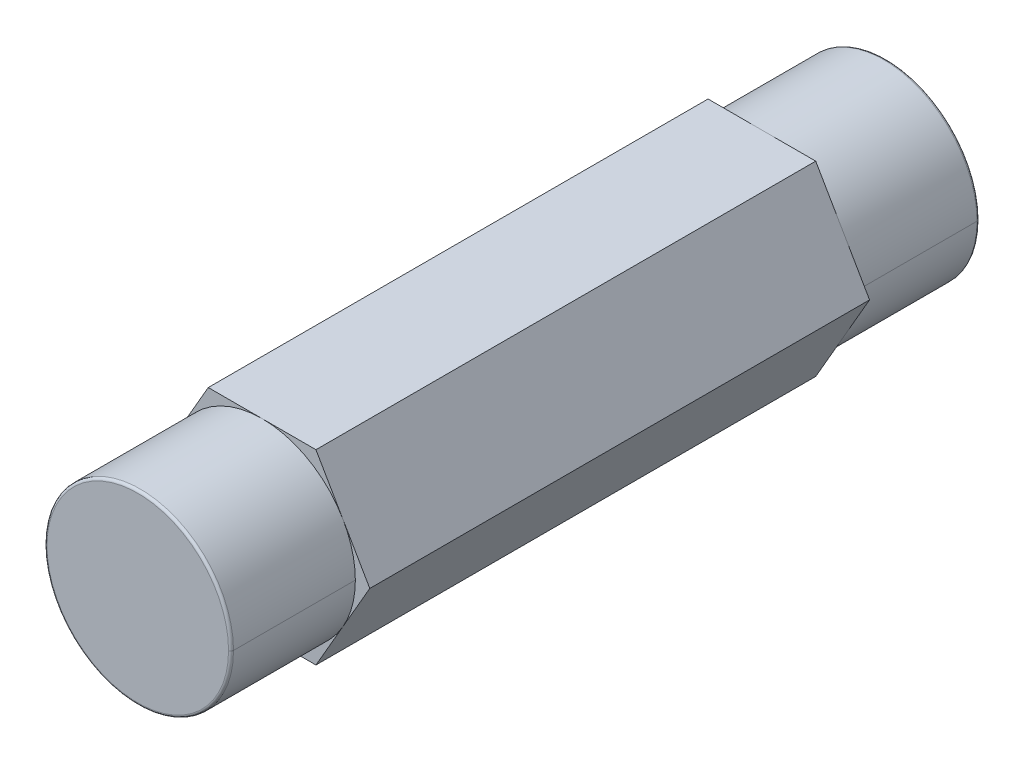
ISO-10303-21;
HEADER;
FILE_DESCRIPTION(('STEP AP214'),'2;1');
FILE_NAME('part.step','',(''),(''),'','','');
FILE_SCHEMA(('AUTOMOTIVE_DESIGN { 1 0 10303 214 1 1 1 1 }'));
ENDSEC;
DATA;
#1=APPLICATION_CONTEXT('core data for automotive mechanical design processes');
#2=APPLICATION_PROTOCOL_DEFINITION('international standard','automotive_design',2000,#1);
#3=PRODUCT_CONTEXT('',#1,'mechanical');
#4=PRODUCT('Part','Part','',(#3));
#5=PRODUCT_RELATED_PRODUCT_CATEGORY('part','',(#4));
#6=PRODUCT_DEFINITION_FORMATION('','',#4);
#7=PRODUCT_DEFINITION_CONTEXT('part definition',#1,'design');
#8=PRODUCT_DEFINITION('design','',#6,#7);
#9=PRODUCT_DEFINITION_SHAPE('','',#8);
#10=(LENGTH_UNIT() NAMED_UNIT(*) SI_UNIT(.MILLI.,.METRE.));
#11=(NAMED_UNIT(*) PLANE_ANGLE_UNIT() SI_UNIT($,.RADIAN.));
#12=(NAMED_UNIT(*) SI_UNIT($,.STERADIAN.) SOLID_ANGLE_UNIT());
#13=UNCERTAINTY_MEASURE_WITH_UNIT(LENGTH_MEASURE(1.E-05),#10,'distance_accuracy_value','');
#14=(GEOMETRIC_REPRESENTATION_CONTEXT(3) GLOBAL_UNCERTAINTY_ASSIGNED_CONTEXT((#13)) GLOBAL_UNIT_ASSIGNED_CONTEXT((#10,
#11,#12)) REPRESENTATION_CONTEXT('',''));
#15=CARTESIAN_POINT('',(0.,0.,0.));
#16=DIRECTION('',(0.,0.,1.));
#17=DIRECTION('',(1.,0.,0.));
#18=AXIS2_PLACEMENT_3D('',#15,#16,#17);
#19=CARTESIAN_POINT('',(0.,0.,38.1));
#20=DIRECTION('',(0.,0.,1.));
#21=DIRECTION('',(1.,0.,0.));
#22=AXIS2_PLACEMENT_3D('',#19,#20,#21);
#23=TOROIDAL_SURFACE('',#22,4.6355,0.127);
#24=CARTESIAN_POINT('',(0.,0.,38.1));
#25=DIRECTION('',(0.,0.,-1.));
#26=DIRECTION('',(1.,0.,0.));
#27=AXIS2_PLACEMENT_3D('',#24,#25,#26);
#28=CIRCLE('',#27,4.7625);
#29=CARTESIAN_POINT('',(-4.7625,0.,38.1));
#30=VERTEX_POINT('',#29);
#31=CARTESIAN_POINT('',(4.7625,0.,38.1));
#32=VERTEX_POINT('',#31);
#33=EDGE_CURVE('E41',#30,#32,#28,.T.);
#34=ORIENTED_EDGE('',*,*,#33,.F.);
#35=CARTESIAN_POINT('',(-4.6355,0.,38.1));
#36=DIRECTION('',(0.,1.,0.));
#37=DIRECTION('',(-1.,0.,0.));
#38=AXIS2_PLACEMENT_3D('',#35,#36,#37);
#39=CIRCLE('',#38,0.127);
#40=CARTESIAN_POINT('',(-4.6355,0.,38.227));
#41=VERTEX_POINT('',#40);
#42=EDGE_CURVE('E11',#30,#41,#39,.T.);
#43=ORIENTED_EDGE('',*,*,#42,.T.);
#44=CARTESIAN_POINT('',(0.,0.,38.227));
#45=DIRECTION('',(0.,0.,1.));
#46=DIRECTION('',(1.,0.,0.));
#47=AXIS2_PLACEMENT_3D('',#44,#45,#46);
#48=CIRCLE('',#47,4.6355);
#49=CARTESIAN_POINT('',(4.6355,0.,38.227));
#50=VERTEX_POINT('',#49);
#51=EDGE_CURVE('E320',#50,#41,#48,.T.);
#52=ORIENTED_EDGE('',*,*,#51,.F.);
#53=CARTESIAN_POINT('',(4.6355,0.,38.1));
#54=DIRECTION('',(0.,-1.,0.));
#55=DIRECTION('',(0.,0.,-1.));
#56=AXIS2_PLACEMENT_3D('',#53,#54,#55);
#57=CIRCLE('',#56,0.127000000000002);
#58=EDGE_CURVE('E305',#32,#50,#57,.T.);
#59=ORIENTED_EDGE('',*,*,#58,.F.);
#60=EDGE_LOOP('',(#34,#43,#52,#59));
#61=FACE_BOUND('',#60,.T.);
#62=ADVANCED_FACE('F16',(#61),#23,.T.);
#63=CARTESIAN_POINT('',(0.,0.,0.127));
#64=DIRECTION('',(0.,0.,1.));
#65=DIRECTION('',(1.,0.,0.));
#66=AXIS2_PLACEMENT_3D('',#63,#64,#65);
#67=TOROIDAL_SURFACE('',#66,4.6355,0.127);
#68=CARTESIAN_POINT('',(0.,0.,0.));
#69=DIRECTION('',(0.,0.,-1.));
#70=DIRECTION('',(1.,0.,0.));
#71=AXIS2_PLACEMENT_3D('',#68,#69,#70);
#72=CIRCLE('',#71,4.6355);
#73=CARTESIAN_POINT('',(-4.6355,0.,0.));
#74=VERTEX_POINT('',#73);
#75=CARTESIAN_POINT('',(4.6355,0.,0.));
#76=VERTEX_POINT('',#75);
#77=EDGE_CURVE('E313',#74,#76,#72,.T.);
#78=ORIENTED_EDGE('',*,*,#77,.F.);
#79=CARTESIAN_POINT('',(-4.6355,0.,0.127));
#80=DIRECTION('',(0.,1.,0.));
#81=DIRECTION('',(-1.,0.,0.));
#82=AXIS2_PLACEMENT_3D('',#79,#80,#81);
#83=CIRCLE('',#82,0.127);
#84=CARTESIAN_POINT('',(-4.7625,0.,0.127));
#85=VERTEX_POINT('',#84);
#86=EDGE_CURVE('E27',#74,#85,#83,.T.);
#87=ORIENTED_EDGE('',*,*,#86,.T.);
#88=CARTESIAN_POINT('',(0.,0.,0.127));
#89=DIRECTION('',(0.,0.,1.));
#90=DIRECTION('',(1.,0.,0.));
#91=AXIS2_PLACEMENT_3D('',#88,#89,#90);
#92=CIRCLE('',#91,4.7625);
#93=CARTESIAN_POINT('',(4.7625,0.,0.127));
#94=VERTEX_POINT('',#93);
#95=EDGE_CURVE('E239',#94,#85,#92,.T.);
#96=ORIENTED_EDGE('',*,*,#95,.F.);
#97=CARTESIAN_POINT('',(4.6355,0.,0.127));
#98=DIRECTION('',(0.,-1.,0.));
#99=DIRECTION('',(0.,0.,-1.));
#100=AXIS2_PLACEMENT_3D('',#97,#98,#99);
#101=CIRCLE('',#100,0.127);
#102=EDGE_CURVE('E231',#76,#94,#101,.T.);
#103=ORIENTED_EDGE('',*,*,#102,.F.);
#104=EDGE_LOOP('',(#78,#87,#96,#103));
#105=FACE_BOUND('',#104,.T.);
#106=ADVANCED_FACE('F18',(#105),#67,.T.);
#107=CARTESIAN_POINT('',(0.,0.,6.35));
#108=DIRECTION('',(0.,0.,-1.));
#109=DIRECTION('',(-1.,0.,0.));
#110=AXIS2_PLACEMENT_3D('',#107,#108,#109);
#111=CYLINDRICAL_SURFACE('',#110,4.7625);
#112=CARTESIAN_POINT('',(0.,0.,6.35));
#113=DIRECTION('',(0.,0.,-1.));
#114=DIRECTION('',(-1.,0.,0.));
#115=AXIS2_PLACEMENT_3D('',#112,#113,#114);
#116=CIRCLE('',#115,4.7625);
#117=CARTESIAN_POINT('',(4.12444598552339,2.38125,6.35));
#118=VERTEX_POINT('',#117);
#119=CARTESIAN_POINT('',(4.7625,0.,6.35));
#120=VERTEX_POINT('',#119);
#121=EDGE_CURVE('E256',#118,#120,#116,.T.);
#122=ORIENTED_EDGE('',*,*,#121,.T.);
#123=DIRECTION('',(0.,0.,-1.));
#124=VECTOR('',#123,1.);
#125=CARTESIAN_POINT('',(4.7625,0.,6.35));
#126=LINE('',#125,#124);
#127=EDGE_CURVE('E250',#120,#94,#126,.T.);
#128=ORIENTED_EDGE('',*,*,#127,.T.);
#129=ORIENTED_EDGE('',*,*,#95,.T.);
#130=DIRECTION('',(0.,0.,-1.));
#131=VECTOR('',#130,1.);
#132=CARTESIAN_POINT('',(-4.7625,0.,6.35));
#133=LINE('',#132,#131);
#134=CARTESIAN_POINT('',(-4.7625,0.,6.35));
#135=VERTEX_POINT('',#134);
#136=EDGE_CURVE('E260',#135,#85,#133,.T.);
#137=ORIENTED_EDGE('',*,*,#136,.F.);
#138=CARTESIAN_POINT('',(0.,0.,6.35));
#139=DIRECTION('',(0.,0.,-1.));
#140=DIRECTION('',(-1.,0.,0.));
#141=AXIS2_PLACEMENT_3D('',#138,#139,#140);
#142=CIRCLE('',#141,4.7625);
#143=CARTESIAN_POINT('',(-4.12444598552339,2.38125,6.35));
#144=VERTEX_POINT('',#143);
#145=EDGE_CURVE('E235',#135,#144,#142,.T.);
#146=ORIENTED_EDGE('',*,*,#145,.T.);
#147=CARTESIAN_POINT('',(0.,0.,6.35));
#148=DIRECTION('',(0.,0.,-1.));
#149=DIRECTION('',(-1.,0.,0.));
#150=AXIS2_PLACEMENT_3D('',#147,#148,#149);
#151=CIRCLE('',#150,4.7625);
#152=CARTESIAN_POINT('',(0.,4.7625,6.35));
#153=VERTEX_POINT('',#152);
#154=EDGE_CURVE('E240',#144,#153,#151,.T.);
#155=ORIENTED_EDGE('',*,*,#154,.T.);
#156=CARTESIAN_POINT('',(0.,0.,6.35));
#157=DIRECTION('',(0.,0.,-1.));
#158=DIRECTION('',(-1.,0.,0.));
#159=AXIS2_PLACEMENT_3D('',#156,#157,#158);
#160=CIRCLE('',#159,4.7625);
#161=EDGE_CURVE('E377',#153,#118,#160,.T.);
#162=ORIENTED_EDGE('',*,*,#161,.T.);
#163=EDGE_LOOP('',(#122,#128,#129,#137,#146,#155,#162));
#164=FACE_BOUND('',#163,.T.);
#165=ADVANCED_FACE('F482',(#164),#111,.T.);
#166=CARTESIAN_POINT('',(0.,0.,31.877));
#167=DIRECTION('',(0.,0.,1.));
#168=DIRECTION('',(1.,0.,0.));
#169=AXIS2_PLACEMENT_3D('',#166,#167,#168);
#170=CYLINDRICAL_SURFACE('',#169,4.7625);
#171=CARTESIAN_POINT('',(0.,0.,31.877));
#172=DIRECTION('',(0.,0.,1.));
#173=DIRECTION('',(1.,0.,0.));
#174=AXIS2_PLACEMENT_3D('',#171,#172,#173);
#175=CIRCLE('',#174,4.7625);
#176=CARTESIAN_POINT('',(-4.12444598552339,2.38125,31.877));
#177=VERTEX_POINT('',#176);
#178=CARTESIAN_POINT('',(-4.7625,0.,31.877));
#179=VERTEX_POINT('',#178);
#180=EDGE_CURVE('E274',#177,#179,#175,.T.);
#181=ORIENTED_EDGE('',*,*,#180,.T.);
#182=DIRECTION('',(0.,0.,1.));
#183=VECTOR('',#182,1.);
#184=CARTESIAN_POINT('',(-4.7625,0.,31.877));
#185=LINE('',#184,#183);
#186=EDGE_CURVE('E267',#179,#30,#185,.T.);
#187=ORIENTED_EDGE('',*,*,#186,.T.);
#188=ORIENTED_EDGE('',*,*,#33,.T.);
#189=DIRECTION('',(0.,0.,1.));
#190=VECTOR('',#189,1.);
#191=CARTESIAN_POINT('',(4.7625,0.,31.877));
#192=LINE('',#191,#190);
#193=CARTESIAN_POINT('',(4.7625,0.,31.877));
#194=VERTEX_POINT('',#193);
#195=EDGE_CURVE('E343',#194,#32,#192,.T.);
#196=ORIENTED_EDGE('',*,*,#195,.F.);
#197=CARTESIAN_POINT('',(0.,0.,31.877));
#198=DIRECTION('',(0.,0.,1.));
#199=DIRECTION('',(1.,0.,0.));
#200=AXIS2_PLACEMENT_3D('',#197,#198,#199);
#201=CIRCLE('',#200,4.7625);
#202=CARTESIAN_POINT('',(4.12444598552339,2.38125,31.877));
#203=VERTEX_POINT('',#202);
#204=EDGE_CURVE('E268',#194,#203,#201,.T.);
#205=ORIENTED_EDGE('',*,*,#204,.T.);
#206=CARTESIAN_POINT('',(0.,0.,31.877));
#207=DIRECTION('',(0.,0.,1.));
#208=DIRECTION('',(1.,0.,0.));
#209=AXIS2_PLACEMENT_3D('',#206,#207,#208);
#210=CIRCLE('',#209,4.7625);
#211=CARTESIAN_POINT('',(0.,4.7625,31.877));
#212=VERTEX_POINT('',#211);
#213=EDGE_CURVE('E270',#203,#212,#210,.T.);
#214=ORIENTED_EDGE('',*,*,#213,.T.);
#215=CARTESIAN_POINT('',(0.,0.,31.877));
#216=DIRECTION('',(0.,0.,1.));
#217=DIRECTION('',(1.,0.,0.));
#218=AXIS2_PLACEMENT_3D('',#215,#216,#217);
#219=CIRCLE('',#218,4.7625);
#220=EDGE_CURVE('E255',#212,#177,#219,.T.);
#221=ORIENTED_EDGE('',*,*,#220,.T.);
#222=EDGE_LOOP('',(#181,#187,#188,#196,#205,#214,#221));
#223=FACE_BOUND('',#222,.T.);
#224=ADVANCED_FACE('F454',(#223),#170,.T.);
#225=CARTESIAN_POINT('',(2.74963065701559,-4.7625,38.227));
#226=DIRECTION('',(-0.866025403784439,0.5,0.));
#227=DIRECTION('',(0.,0.,1.));
#228=AXIS2_PLACEMENT_3D('',#225,#226,#227);
#229=PLANE('',#228);
#230=DIRECTION('',(-0.5,-0.866025403784439,0.));
#231=VECTOR('',#230,1.);
#232=CARTESIAN_POINT('',(2.74963065701559,-4.7625,6.35));
#233=LINE('',#232,#231);
#234=CARTESIAN_POINT('',(5.49926131403119,0.,6.35));
#235=VERTEX_POINT('',#234);
#236=CARTESIAN_POINT('',(4.12444598552339,-2.38125,6.35));
#237=VERTEX_POINT('',#236);
#238=EDGE_CURVE('E106',#235,#237,#233,.T.);
#239=ORIENTED_EDGE('',*,*,#238,.F.);
#240=DIRECTION('',(0.,0.,-1.));
#241=VECTOR('',#240,1.);
#242=CARTESIAN_POINT('',(5.49926131403119,0.,38.227));
#243=LINE('',#242,#241);
#244=CARTESIAN_POINT('',(5.49926131403119,0.,31.877));
#245=VERTEX_POINT('',#244);
#246=EDGE_CURVE('E244',#245,#235,#243,.T.);
#247=ORIENTED_EDGE('',*,*,#246,.F.);
#248=DIRECTION('',(0.5,0.866025403784439,0.));
#249=VECTOR('',#248,1.);
#250=CARTESIAN_POINT('',(2.74963065701559,-4.7625,31.877));
#251=LINE('',#250,#249);
#252=CARTESIAN_POINT('',(4.12444598552339,-2.38125,31.877));
#253=VERTEX_POINT('',#252);
#254=EDGE_CURVE('E292',#253,#245,#251,.T.);
#255=ORIENTED_EDGE('',*,*,#254,.F.);
#256=DIRECTION('',(0.5,0.866025403784439,0.));
#257=VECTOR('',#256,1.);
#258=CARTESIAN_POINT('',(2.74963065701559,-4.7625,31.877));
#259=LINE('',#258,#257);
#260=CARTESIAN_POINT('',(2.74963065701559,-4.7625,31.877));
#261=VERTEX_POINT('',#260);
#262=EDGE_CURVE('E213',#261,#253,#259,.T.);
#263=ORIENTED_EDGE('',*,*,#262,.F.);
#264=DIRECTION('',(0.,0.,-1.));
#265=VECTOR('',#264,1.);
#266=CARTESIAN_POINT('',(2.74963065701559,-4.7625,38.227));
#267=LINE('',#266,#265);
#268=CARTESIAN_POINT('',(2.74963065701559,-4.7625,6.35));
#269=VERTEX_POINT('',#268);
#270=EDGE_CURVE('E251',#261,#269,#267,.T.);
#271=ORIENTED_EDGE('',*,*,#270,.T.);
#272=DIRECTION('',(-0.5,-0.866025403784439,0.));
#273=VECTOR('',#272,1.);
#274=CARTESIAN_POINT('',(2.74963065701559,-4.7625,6.35));
#275=LINE('',#274,#273);
#276=EDGE_CURVE('E328',#237,#269,#275,.T.);
#277=ORIENTED_EDGE('',*,*,#276,.F.);
#278=EDGE_LOOP('',(#239,#247,#255,#263,#271,#277));
#279=FACE_BOUND('',#278,.T.);
#280=ADVANCED_FACE('F441',(#279),#229,.F.);
#281=CARTESIAN_POINT('',(5.49926131403119,0.,38.227));
#282=DIRECTION('',(-0.866025403784438,-0.5,0.));
#283=DIRECTION('',(-0.5,0.866025403784438,0.));
#284=AXIS2_PLACEMENT_3D('',#281,#282,#283);
#285=PLANE('',#284);
#286=DIRECTION('',(0.5,-0.866025403784439,0.));
#287=VECTOR('',#286,1.);
#288=CARTESIAN_POINT('',(5.49926131403119,0.,6.35));
#289=LINE('',#288,#287);
#290=CARTESIAN_POINT('',(2.74963065701558,4.7625,6.35));
#291=VERTEX_POINT('',#290);
#292=EDGE_CURVE('E275',#291,#118,#289,.T.);
#293=ORIENTED_EDGE('',*,*,#292,.F.);
#294=DIRECTION('',(0.,0.,-1.));
#295=VECTOR('',#294,1.);
#296=CARTESIAN_POINT('',(2.74963065701558,4.7625,38.227));
#297=LINE('',#296,#295);
#298=CARTESIAN_POINT('',(2.74963065701558,4.7625,31.877));
#299=VERTEX_POINT('',#298);
#300=EDGE_CURVE('E241',#299,#291,#297,.T.);
#301=ORIENTED_EDGE('',*,*,#300,.F.);
#302=DIRECTION('',(-0.5,0.866025403784439,0.));
#303=VECTOR('',#302,1.);
#304=CARTESIAN_POINT('',(5.49926131403119,0.,31.877));
#305=LINE('',#304,#303);
#306=EDGE_CURVE('E293',#203,#299,#305,.T.);
#307=ORIENTED_EDGE('',*,*,#306,.F.);
#308=DIRECTION('',(-0.5,0.866025403784439,0.));
#309=VECTOR('',#308,1.);
#310=CARTESIAN_POINT('',(5.49926131403119,0.,31.877));
#311=LINE('',#310,#309);
#312=EDGE_CURVE('E288',#245,#203,#311,.T.);
#313=ORIENTED_EDGE('',*,*,#312,.F.);
#314=ORIENTED_EDGE('',*,*,#246,.T.);
#315=DIRECTION('',(0.5,-0.866025403784439,0.));
#316=VECTOR('',#315,1.);
#317=CARTESIAN_POINT('',(5.49926131403119,0.,6.35));
#318=LINE('',#317,#316);
#319=EDGE_CURVE('E279',#118,#235,#318,.T.);
#320=ORIENTED_EDGE('',*,*,#319,.F.);
#321=EDGE_LOOP('',(#293,#301,#307,#313,#314,#320));
#322=FACE_BOUND('',#321,.T.);
#323=ADVANCED_FACE('F513',(#322),#285,.F.);
#324=CARTESIAN_POINT('',(2.74963065701558,4.7625,38.227));
#325=DIRECTION('',(0.,-1.,0.));
#326=DIRECTION('',(0.,0.,-1.));
#327=AXIS2_PLACEMENT_3D('',#324,#325,#326);
#328=PLANE('',#327);
#329=DIRECTION('',(1.,0.,0.));
#330=VECTOR('',#329,1.);
#331=CARTESIAN_POINT('',(2.74963065701558,4.7625,6.35));
#332=LINE('',#331,#330);
#333=CARTESIAN_POINT('',(-2.7496306570156,4.7625,6.35));
#334=VERTEX_POINT('',#333);
#335=EDGE_CURVE('E297',#334,#153,#332,.T.);
#336=ORIENTED_EDGE('',*,*,#335,.F.);
#337=DIRECTION('',(0.,0.,-1.));
#338=VECTOR('',#337,1.);
#339=CARTESIAN_POINT('',(-2.7496306570156,4.7625,38.227));
#340=LINE('',#339,#338);
#341=CARTESIAN_POINT('',(-2.7496306570156,4.7625,31.877));
#342=VERTEX_POINT('',#341);
#343=EDGE_CURVE('E245',#342,#334,#340,.T.);
#344=ORIENTED_EDGE('',*,*,#343,.F.);
#345=DIRECTION('',(-1.,0.,0.));
#346=VECTOR('',#345,1.);
#347=CARTESIAN_POINT('',(2.74963065701558,4.7625,31.877));
#348=LINE('',#347,#346);
#349=EDGE_CURVE('E284',#212,#342,#348,.T.);
#350=ORIENTED_EDGE('',*,*,#349,.F.);
#351=DIRECTION('',(-1.,0.,0.));
#352=VECTOR('',#351,1.);
#353=CARTESIAN_POINT('',(2.74963065701558,4.7625,31.877));
#354=LINE('',#353,#352);
#355=EDGE_CURVE('E287',#299,#212,#354,.T.);
#356=ORIENTED_EDGE('',*,*,#355,.F.);
#357=ORIENTED_EDGE('',*,*,#300,.T.);
#358=DIRECTION('',(1.,0.,0.));
#359=VECTOR('',#358,1.);
#360=CARTESIAN_POINT('',(2.74963065701558,4.7625,6.35));
#361=LINE('',#360,#359);
#362=EDGE_CURVE('E278',#153,#291,#361,.T.);
#363=ORIENTED_EDGE('',*,*,#362,.F.);
#364=EDGE_LOOP('',(#336,#344,#350,#356,#357,#363));
#365=FACE_BOUND('',#364,.T.);
#366=ADVANCED_FACE('F494',(#365),#328,.F.);
#367=CARTESIAN_POINT('',(-2.7496306570156,4.7625,38.227));
#368=DIRECTION('',(0.866025403784439,-0.5,0.));
#369=DIRECTION('',(0.,0.,-1.));
#370=AXIS2_PLACEMENT_3D('',#367,#368,#369);
#371=PLANE('',#370);
#372=DIRECTION('',(0.5,0.866025403784439,0.));
#373=VECTOR('',#372,1.);
#374=CARTESIAN_POINT('',(-2.7496306570156,4.7625,6.35));
#375=LINE('',#374,#373);
#376=CARTESIAN_POINT('',(-5.4992613140312,0.,6.35));
#377=VERTEX_POINT('',#376);
#378=EDGE_CURVE('E304',#377,#144,#375,.T.);
#379=ORIENTED_EDGE('',*,*,#378,.F.);
#380=DIRECTION('',(0.,0.,-1.));
#381=VECTOR('',#380,1.);
#382=CARTESIAN_POINT('',(-5.4992613140312,0.,38.227));
#383=LINE('',#382,#381);
#384=CARTESIAN_POINT('',(-5.4992613140312,0.,31.877));
#385=VERTEX_POINT('',#384);
#386=EDGE_CURVE('E212',#385,#377,#383,.T.);
#387=ORIENTED_EDGE('',*,*,#386,.F.);
#388=DIRECTION('',(-0.5,-0.866025403784439,0.));
#389=VECTOR('',#388,1.);
#390=CARTESIAN_POINT('',(-2.7496306570156,4.7625,31.877));
#391=LINE('',#390,#389);
#392=EDGE_CURVE('E20',#177,#385,#391,.T.);
#393=ORIENTED_EDGE('',*,*,#392,.F.);
#394=DIRECTION('',(-0.5,-0.866025403784439,0.));
#395=VECTOR('',#394,1.);
#396=CARTESIAN_POINT('',(-2.7496306570156,4.7625,31.877));
#397=LINE('',#396,#395);
#398=EDGE_CURVE('E280',#342,#177,#397,.T.);
#399=ORIENTED_EDGE('',*,*,#398,.F.);
#400=ORIENTED_EDGE('',*,*,#343,.T.);
#401=DIRECTION('',(0.5,0.866025403784439,0.));
#402=VECTOR('',#401,1.);
#403=CARTESIAN_POINT('',(-2.7496306570156,4.7625,6.35));
#404=LINE('',#403,#402);
#405=EDGE_CURVE('E294',#144,#334,#404,.T.);
#406=ORIENTED_EDGE('',*,*,#405,.F.);
#407=EDGE_LOOP('',(#379,#387,#393,#399,#400,#406));
#408=FACE_BOUND('',#407,.T.);
#409=ADVANCED_FACE('F427',(#408),#371,.F.);
#410=CARTESIAN_POINT('',(-5.4992613140312,0.,38.227));
#411=DIRECTION('',(0.866025403784439,0.5,0.));
#412=DIRECTION('',(0.,0.,-1.));
#413=AXIS2_PLACEMENT_3D('',#410,#411,#412);
#414=PLANE('',#413);
#415=DIRECTION('',(-0.5,0.866025403784439,0.));
#416=VECTOR('',#415,1.);
#417=CARTESIAN_POINT('',(-5.4992613140312,0.,6.35));
#418=LINE('',#417,#416);
#419=CARTESIAN_POINT('',(-2.7496306570156,-4.7625,6.35));
#420=VERTEX_POINT('',#419);
#421=CARTESIAN_POINT('',(-4.12444598552339,-2.38125,6.35));
#422=VERTEX_POINT('',#421);
#423=EDGE_CURVE('E207',#420,#422,#418,.T.);
#424=ORIENTED_EDGE('',*,*,#423,.F.);
#425=DIRECTION('',(0.,0.,-1.));
#426=VECTOR('',#425,1.);
#427=CARTESIAN_POINT('',(-2.7496306570156,-4.7625,38.227));
#428=LINE('',#427,#426);
#429=CARTESIAN_POINT('',(-2.7496306570156,-4.7625,31.877));
#430=VERTEX_POINT('',#429);
#431=EDGE_CURVE('E203',#430,#420,#428,.T.);
#432=ORIENTED_EDGE('',*,*,#431,.F.);
#433=DIRECTION('',(0.5,-0.866025403784439,0.));
#434=VECTOR('',#433,1.);
#435=CARTESIAN_POINT('',(-5.4992613140312,0.,31.877));
#436=LINE('',#435,#434);
#437=CARTESIAN_POINT('',(-4.12444598552339,-2.38125,31.877));
#438=VERTEX_POINT('',#437);
#439=EDGE_CURVE('E188',#438,#430,#436,.T.);
#440=ORIENTED_EDGE('',*,*,#439,.F.);
#441=DIRECTION('',(0.5,-0.866025403784439,0.));
#442=VECTOR('',#441,1.);
#443=CARTESIAN_POINT('',(-5.4992613140312,0.,31.877));
#444=LINE('',#443,#442);
#445=EDGE_CURVE('E200',#385,#438,#444,.T.);
#446=ORIENTED_EDGE('',*,*,#445,.F.);
#447=ORIENTED_EDGE('',*,*,#386,.T.);
#448=DIRECTION('',(-0.5,0.866025403784439,0.));
#449=VECTOR('',#448,1.);
#450=CARTESIAN_POINT('',(-5.4992613140312,0.,6.35));
#451=LINE('',#450,#449);
#452=EDGE_CURVE('E327',#422,#377,#451,.T.);
#453=ORIENTED_EDGE('',*,*,#452,.F.);
#454=EDGE_LOOP('',(#424,#432,#440,#446,#447,#453));
#455=FACE_BOUND('',#454,.T.);
#456=ADVANCED_FACE('F204',(#455),#414,.F.);
#457=CARTESIAN_POINT('',(-2.7496306570156,-4.7625,38.227));
#458=DIRECTION('',(0.,1.,0.));
#459=DIRECTION('',(1.,0.,0.));
#460=AXIS2_PLACEMENT_3D('',#457,#458,#459);
#461=PLANE('',#460);
#462=DIRECTION('',(-1.,0.,0.));
#463=VECTOR('',#462,1.);
#464=CARTESIAN_POINT('',(-2.7496306570156,-4.7625,6.35));
#465=LINE('',#464,#463);
#466=CARTESIAN_POINT('',(0.,-4.7625,6.35));
#467=VERTEX_POINT('',#466);
#468=EDGE_CURVE('E331',#269,#467,#465,.T.);
#469=ORIENTED_EDGE('',*,*,#468,.F.);
#470=ORIENTED_EDGE('',*,*,#270,.F.);
#471=DIRECTION('',(1.,0.,0.));
#472=VECTOR('',#471,1.);
#473=CARTESIAN_POINT('',(-2.7496306570156,-4.7625,31.877));
#474=LINE('',#473,#472);
#475=CARTESIAN_POINT('',(0.,-4.7625,31.877));
#476=VERTEX_POINT('',#475);
#477=EDGE_CURVE('E219',#476,#261,#474,.T.);
#478=ORIENTED_EDGE('',*,*,#477,.F.);
#479=DIRECTION('',(1.,0.,0.));
#480=VECTOR('',#479,1.);
#481=CARTESIAN_POINT('',(-2.7496306570156,-4.7625,31.877));
#482=LINE('',#481,#480);
#483=EDGE_CURVE('E192',#430,#476,#482,.T.);
#484=ORIENTED_EDGE('',*,*,#483,.F.);
#485=ORIENTED_EDGE('',*,*,#431,.T.);
#486=DIRECTION('',(-1.,0.,0.));
#487=VECTOR('',#486,1.);
#488=CARTESIAN_POINT('',(-2.7496306570156,-4.7625,6.35));
#489=LINE('',#488,#487);
#490=EDGE_CURVE('E346',#467,#420,#489,.T.);
#491=ORIENTED_EDGE('',*,*,#490,.F.);
#492=EDGE_LOOP('',(#469,#470,#478,#484,#485,#491));
#493=FACE_BOUND('',#492,.T.);
#494=ADVANCED_FACE('F216',(#493),#461,.F.);
#495=CARTESIAN_POINT('',(0.,0.,31.877));
#496=DIRECTION('',(0.,0.,1.));
#497=DIRECTION('',(1.,0.,0.));
#498=AXIS2_PLACEMENT_3D('',#495,#496,#497);
#499=PLANE('',#498);
#500=ORIENTED_EDGE('',*,*,#262,.T.);
#501=CARTESIAN_POINT('',(0.,0.,31.877));
#502=DIRECTION('',(0.,0.,1.));
#503=DIRECTION('',(1.,0.,0.));
#504=AXIS2_PLACEMENT_3D('',#501,#502,#503);
#505=CIRCLE('',#504,4.7625);
#506=EDGE_CURVE('E234',#476,#253,#505,.T.);
#507=ORIENTED_EDGE('',*,*,#506,.F.);
#508=ORIENTED_EDGE('',*,*,#477,.T.);
#509=EDGE_LOOP('',(#500,#507,#508));
#510=FACE_BOUND('',#509,.T.);
#511=ADVANCED_FACE('F444',(#510),#499,.T.);
#512=CARTESIAN_POINT('',(0.,0.,31.877));
#513=DIRECTION('',(0.,0.,1.));
#514=DIRECTION('',(1.,0.,0.));
#515=AXIS2_PLACEMENT_3D('',#512,#513,#514);
#516=PLANE('',#515);
#517=ORIENTED_EDGE('',*,*,#254,.T.);
#518=ORIENTED_EDGE('',*,*,#312,.T.);
#519=ORIENTED_EDGE('',*,*,#204,.F.);
#520=CARTESIAN_POINT('',(0.,0.,31.877));
#521=DIRECTION('',(0.,0.,1.));
#522=DIRECTION('',(1.,0.,0.));
#523=AXIS2_PLACEMENT_3D('',#520,#521,#522);
#524=CIRCLE('',#523,4.7625);
#525=EDGE_CURVE('E339',#253,#194,#524,.T.);
#526=ORIENTED_EDGE('',*,*,#525,.F.);
#527=EDGE_LOOP('',(#517,#518,#519,#526));
#528=FACE_BOUND('',#527,.T.);
#529=ADVANCED_FACE('F450',(#528),#516,.T.);
#530=CARTESIAN_POINT('',(0.,0.,31.877));
#531=DIRECTION('',(0.,0.,1.));
#532=DIRECTION('',(1.,0.,0.));
#533=AXIS2_PLACEMENT_3D('',#530,#531,#532);
#534=PLANE('',#533);
#535=ORIENTED_EDGE('',*,*,#306,.T.);
#536=ORIENTED_EDGE('',*,*,#355,.T.);
#537=ORIENTED_EDGE('',*,*,#213,.F.);
#538=EDGE_LOOP('',(#535,#536,#537));
#539=FACE_BOUND('',#538,.T.);
#540=ADVANCED_FACE('F497',(#539),#534,.T.);
#541=CARTESIAN_POINT('',(0.,0.,31.877));
#542=DIRECTION('',(0.,0.,1.));
#543=DIRECTION('',(1.,0.,0.));
#544=AXIS2_PLACEMENT_3D('',#541,#542,#543);
#545=PLANE('',#544);
#546=ORIENTED_EDGE('',*,*,#349,.T.);
#547=ORIENTED_EDGE('',*,*,#398,.T.);
#548=ORIENTED_EDGE('',*,*,#220,.F.);
#549=EDGE_LOOP('',(#546,#547,#548));
#550=FACE_BOUND('',#549,.T.);
#551=ADVANCED_FACE('F499',(#550),#545,.T.);
#552=CARTESIAN_POINT('',(0.,0.,31.877));
#553=DIRECTION('',(0.,0.,1.));
#554=DIRECTION('',(1.,0.,0.));
#555=AXIS2_PLACEMENT_3D('',#552,#553,#554);
#556=PLANE('',#555);
#557=ORIENTED_EDGE('',*,*,#392,.T.);
#558=ORIENTED_EDGE('',*,*,#445,.T.);
#559=CARTESIAN_POINT('',(0.,0.,31.877));
#560=DIRECTION('',(0.,0.,1.));
#561=DIRECTION('',(1.,0.,0.));
#562=AXIS2_PLACEMENT_3D('',#559,#560,#561);
#563=CIRCLE('',#562,4.7625);
#564=EDGE_CURVE('E221',#179,#438,#563,.T.);
#565=ORIENTED_EDGE('',*,*,#564,.F.);
#566=ORIENTED_EDGE('',*,*,#180,.F.);
#567=EDGE_LOOP('',(#557,#558,#565,#566));
#568=FACE_BOUND('',#567,.T.);
#569=ADVANCED_FACE('F426',(#568),#556,.T.);
#570=CARTESIAN_POINT('',(0.,0.,31.877));
#571=DIRECTION('',(0.,0.,1.));
#572=DIRECTION('',(1.,0.,0.));
#573=AXIS2_PLACEMENT_3D('',#570,#571,#572);
#574=PLANE('',#573);
#575=ORIENTED_EDGE('',*,*,#439,.T.);
#576=ORIENTED_EDGE('',*,*,#483,.T.);
#577=CARTESIAN_POINT('',(0.,0.,31.877));
#578=DIRECTION('',(0.,0.,1.));
#579=DIRECTION('',(1.,0.,0.));
#580=AXIS2_PLACEMENT_3D('',#577,#578,#579);
#581=CIRCLE('',#580,4.7625);
#582=EDGE_CURVE('E195',#438,#476,#581,.T.);
#583=ORIENTED_EDGE('',*,*,#582,.F.);
#584=EDGE_LOOP('',(#575,#576,#583));
#585=FACE_BOUND('',#584,.T.);
#586=ADVANCED_FACE('F190',(#585),#574,.T.);
#587=CARTESIAN_POINT('',(0.,0.,31.877));
#588=DIRECTION('',(0.,0.,1.));
#589=DIRECTION('',(1.,0.,0.));
#590=AXIS2_PLACEMENT_3D('',#587,#588,#589);
#591=CYLINDRICAL_SURFACE('',#590,4.7625);
#592=ORIENTED_EDGE('',*,*,#186,.F.);
#593=ORIENTED_EDGE('',*,*,#564,.T.);
#594=ORIENTED_EDGE('',*,*,#582,.T.);
#595=ORIENTED_EDGE('',*,*,#506,.T.);
#596=ORIENTED_EDGE('',*,*,#525,.T.);
#597=ORIENTED_EDGE('',*,*,#195,.T.);
#598=CARTESIAN_POINT('',(0.,0.,38.1));
#599=DIRECTION('',(0.,0.,-1.));
#600=DIRECTION('',(1.,0.,0.));
#601=AXIS2_PLACEMENT_3D('',#598,#599,#600);
#602=CIRCLE('',#601,4.7625);
#603=EDGE_CURVE('E323',#32,#30,#602,.T.);
#604=ORIENTED_EDGE('',*,*,#603,.T.);
#605=EDGE_LOOP('',(#592,#593,#594,#595,#596,#597,#604));
#606=FACE_BOUND('',#605,.T.);
#607=ADVANCED_FACE('F447',(#606),#591,.T.);
#608=CARTESIAN_POINT('',(5.49926131403119,0.,38.227));
#609=DIRECTION('',(0.,0.,1.));
#610=DIRECTION('',(1.,0.,0.));
#611=AXIS2_PLACEMENT_3D('',#608,#609,#610);
#612=PLANE('',#611);
#613=ORIENTED_EDGE('',*,*,#51,.T.);
#614=CARTESIAN_POINT('',(0.,0.,38.227));
#615=DIRECTION('',(0.,0.,1.));
#616=DIRECTION('',(1.,0.,0.));
#617=AXIS2_PLACEMENT_3D('',#614,#615,#616);
#618=CIRCLE('',#617,4.6355);
#619=EDGE_CURVE('E324',#41,#50,#618,.T.);
#620=ORIENTED_EDGE('',*,*,#619,.T.);
#621=EDGE_LOOP('',(#613,#620));
#622=FACE_BOUND('',#621,.T.);
#623=ADVANCED_FACE('F463',(#622),#612,.T.);
#624=CARTESIAN_POINT('',(0.,0.,6.35));
#625=DIRECTION('',(0.,0.,-1.));
#626=DIRECTION('',(0.,-1.,0.));
#627=AXIS2_PLACEMENT_3D('',#624,#625,#626);
#628=PLANE('',#627);
#629=ORIENTED_EDGE('',*,*,#335,.T.);
#630=ORIENTED_EDGE('',*,*,#154,.F.);
#631=ORIENTED_EDGE('',*,*,#405,.T.);
#632=EDGE_LOOP('',(#629,#630,#631));
#633=FACE_BOUND('',#632,.T.);
#634=ADVANCED_FACE('F465',(#633),#628,.T.);
#635=CARTESIAN_POINT('',(0.,0.,6.35));
#636=DIRECTION('',(0.,0.,-1.));
#637=DIRECTION('',(0.,-1.,0.));
#638=AXIS2_PLACEMENT_3D('',#635,#636,#637);
#639=PLANE('',#638);
#640=ORIENTED_EDGE('',*,*,#362,.T.);
#641=ORIENTED_EDGE('',*,*,#292,.T.);
#642=ORIENTED_EDGE('',*,*,#161,.F.);
#643=EDGE_LOOP('',(#640,#641,#642));
#644=FACE_BOUND('',#643,.T.);
#645=ADVANCED_FACE('F472',(#644),#639,.T.);
#646=CARTESIAN_POINT('',(0.,0.,6.35));
#647=DIRECTION('',(0.,0.,-1.));
#648=DIRECTION('',(0.,-1.,0.));
#649=AXIS2_PLACEMENT_3D('',#646,#647,#648);
#650=PLANE('',#649);
#651=ORIENTED_EDGE('',*,*,#319,.T.);
#652=ORIENTED_EDGE('',*,*,#238,.T.);
#653=CARTESIAN_POINT('',(0.,0.,6.35));
#654=DIRECTION('',(0.,0.,-1.));
#655=DIRECTION('',(-1.,0.,0.));
#656=AXIS2_PLACEMENT_3D('',#653,#654,#655);
#657=CIRCLE('',#656,4.7625);
#658=EDGE_CURVE('E363',#120,#237,#657,.T.);
#659=ORIENTED_EDGE('',*,*,#658,.F.);
#660=ORIENTED_EDGE('',*,*,#121,.F.);
#661=EDGE_LOOP('',(#651,#652,#659,#660));
#662=FACE_BOUND('',#661,.T.);
#663=ADVANCED_FACE('F496',(#662),#650,.T.);
#664=CARTESIAN_POINT('',(0.,0.,6.35));
#665=DIRECTION('',(0.,0.,-1.));
#666=DIRECTION('',(0.,-1.,0.));
#667=AXIS2_PLACEMENT_3D('',#664,#665,#666);
#668=PLANE('',#667);
#669=ORIENTED_EDGE('',*,*,#378,.T.);
#670=ORIENTED_EDGE('',*,*,#145,.F.);
#671=CARTESIAN_POINT('',(0.,0.,6.35));
#672=DIRECTION('',(0.,0.,-1.));
#673=DIRECTION('',(-1.,0.,0.));
#674=AXIS2_PLACEMENT_3D('',#671,#672,#673);
#675=CIRCLE('',#674,4.7625);
#676=EDGE_CURVE('E263',#422,#135,#675,.T.);
#677=ORIENTED_EDGE('',*,*,#676,.F.);
#678=ORIENTED_EDGE('',*,*,#452,.T.);
#679=EDGE_LOOP('',(#669,#670,#677,#678));
#680=FACE_BOUND('',#679,.T.);
#681=ADVANCED_FACE('F431',(#680),#668,.T.);
#682=CARTESIAN_POINT('',(0.,0.,6.35));
#683=DIRECTION('',(0.,0.,-1.));
#684=DIRECTION('',(0.,-1.,0.));
#685=AXIS2_PLACEMENT_3D('',#682,#683,#684);
#686=PLANE('',#685);
#687=ORIENTED_EDGE('',*,*,#276,.T.);
#688=ORIENTED_EDGE('',*,*,#468,.T.);
#689=CARTESIAN_POINT('',(0.,0.,6.35));
#690=DIRECTION('',(0.,0.,-1.));
#691=DIRECTION('',(-1.,0.,0.));
#692=AXIS2_PLACEMENT_3D('',#689,#690,#691);
#693=CIRCLE('',#692,4.7625);
#694=EDGE_CURVE('E371',#237,#467,#693,.T.);
#695=ORIENTED_EDGE('',*,*,#694,.F.);
#696=EDGE_LOOP('',(#687,#688,#695));
#697=FACE_BOUND('',#696,.T.);
#698=ADVANCED_FACE('F440',(#697),#686,.T.);
#699=CARTESIAN_POINT('',(0.,0.,6.35));
#700=DIRECTION('',(0.,0.,-1.));
#701=DIRECTION('',(0.,-1.,0.));
#702=AXIS2_PLACEMENT_3D('',#699,#700,#701);
#703=PLANE('',#702);
#704=ORIENTED_EDGE('',*,*,#423,.T.);
#705=CARTESIAN_POINT('',(0.,0.,6.35));
#706=DIRECTION('',(0.,0.,-1.));
#707=DIRECTION('',(-1.,0.,0.));
#708=AXIS2_PLACEMENT_3D('',#705,#706,#707);
#709=CIRCLE('',#708,4.7625);
#710=EDGE_CURVE('E338',#467,#422,#709,.T.);
#711=ORIENTED_EDGE('',*,*,#710,.F.);
#712=ORIENTED_EDGE('',*,*,#490,.T.);
#713=EDGE_LOOP('',(#704,#711,#712));
#714=FACE_BOUND('',#713,.T.);
#715=ADVANCED_FACE('F437',(#714),#703,.T.);
#716=CARTESIAN_POINT('',(0.,0.,6.35));
#717=DIRECTION('',(0.,0.,-1.));
#718=DIRECTION('',(-1.,0.,0.));
#719=AXIS2_PLACEMENT_3D('',#716,#717,#718);
#720=CYLINDRICAL_SURFACE('',#719,4.7625);
#721=ORIENTED_EDGE('',*,*,#127,.F.);
#722=ORIENTED_EDGE('',*,*,#658,.T.);
#723=ORIENTED_EDGE('',*,*,#694,.T.);
#724=ORIENTED_EDGE('',*,*,#710,.T.);
#725=ORIENTED_EDGE('',*,*,#676,.T.);
#726=ORIENTED_EDGE('',*,*,#136,.T.);
#727=CARTESIAN_POINT('',(0.,0.,0.127));
#728=DIRECTION('',(0.,0.,1.));
#729=DIRECTION('',(1.,0.,0.));
#730=AXIS2_PLACEMENT_3D('',#727,#728,#729);
#731=CIRCLE('',#730,4.7625);
#732=EDGE_CURVE('E264',#85,#94,#731,.T.);
#733=ORIENTED_EDGE('',*,*,#732,.T.);
#734=EDGE_LOOP('',(#721,#722,#723,#724,#725,#726,#733));
#735=FACE_BOUND('',#734,.T.);
#736=ADVANCED_FACE('F491',(#735),#720,.T.);
#737=CARTESIAN_POINT('',(5.49926131403119,0.,0.));
#738=DIRECTION('',(0.,0.,1.));
#739=DIRECTION('',(1.,0.,0.));
#740=AXIS2_PLACEMENT_3D('',#737,#738,#739);
#741=PLANE('',#740);
#742=CARTESIAN_POINT('',(0.,0.,0.));
#743=DIRECTION('',(0.,0.,-1.));
#744=DIRECTION('',(1.,0.,0.));
#745=AXIS2_PLACEMENT_3D('',#742,#743,#744);
#746=CIRCLE('',#745,4.6355);
#747=EDGE_CURVE('E309',#76,#74,#746,.T.);
#748=ORIENTED_EDGE('',*,*,#747,.T.);
#749=ORIENTED_EDGE('',*,*,#77,.T.);
#750=EDGE_LOOP('',(#748,#749));
#751=FACE_BOUND('',#750,.T.);
#752=ADVANCED_FACE('F718',(#751),#741,.F.);
#753=CARTESIAN_POINT('',(0.,0.,0.127));
#754=DIRECTION('',(0.,0.,1.));
#755=DIRECTION('',(1.,0.,0.));
#756=AXIS2_PLACEMENT_3D('',#753,#754,#755);
#757=TOROIDAL_SURFACE('',#756,4.6355,0.127);
#758=ORIENTED_EDGE('',*,*,#86,.F.);
#759=ORIENTED_EDGE('',*,*,#747,.F.);
#760=ORIENTED_EDGE('',*,*,#102,.T.);
#761=ORIENTED_EDGE('',*,*,#732,.F.);
#762=EDGE_LOOP('',(#758,#759,#760,#761));
#763=FACE_BOUND('',#762,.T.);
#764=ADVANCED_FACE('F525',(#763),#757,.T.);
#765=CARTESIAN_POINT('',(0.,0.,38.1));
#766=DIRECTION('',(0.,0.,1.));
#767=DIRECTION('',(1.,0.,0.));
#768=AXIS2_PLACEMENT_3D('',#765,#766,#767);
#769=TOROIDAL_SURFACE('',#768,4.6355,0.127);
#770=ORIENTED_EDGE('',*,*,#42,.F.);
#771=ORIENTED_EDGE('',*,*,#603,.F.);
#772=ORIENTED_EDGE('',*,*,#58,.T.);
#773=ORIENTED_EDGE('',*,*,#619,.F.);
#774=EDGE_LOOP('',(#770,#771,#772,#773));
#775=FACE_BOUND('',#774,.T.);
#776=ADVANCED_FACE('F459',(#775),#769,.T.);
#777=CLOSED_SHELL('',(#62,#106,#165,#224,#280,#323,#366,#409,#456,#494,#511,#529,#540,#551,#569,
#586,#607,#623,#634,#645,#663,#681,#698,#715,#736,#752,#764,#776));
#778=MANIFOLD_SOLID_BREP('B1',#777);
#779=ADVANCED_BREP_SHAPE_REPRESENTATION('',(#18,#778),#14);
#780=SHAPE_DEFINITION_REPRESENTATION(#9,#779);
ENDSEC;
END-ISO-10303-21;
